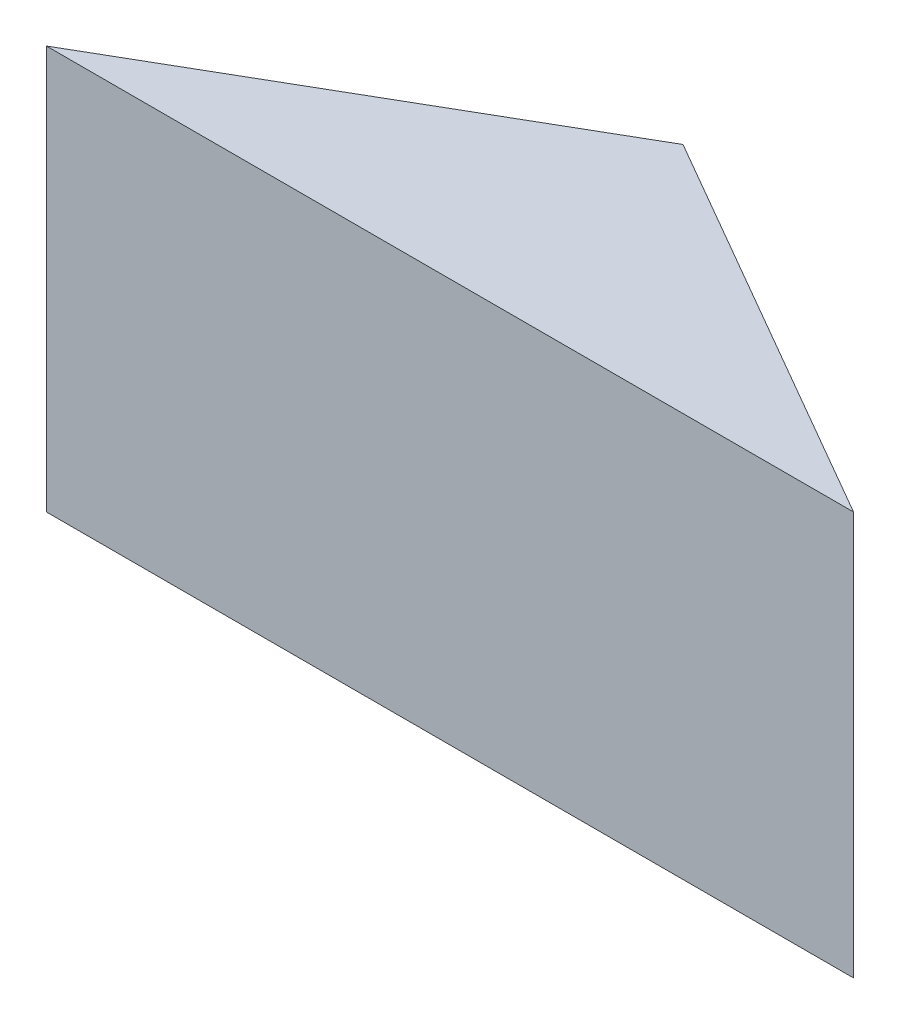
ISO-10303-21;
HEADER;
FILE_DESCRIPTION(('STEP AP214'),'2;1');
FILE_NAME('part.step','',(''),(''),'','','');
FILE_SCHEMA(('AUTOMOTIVE_DESIGN { 1 0 10303 214 1 1 1 1 }'));
ENDSEC;
DATA;
#1=APPLICATION_CONTEXT('core data for automotive mechanical design processes');
#2=APPLICATION_PROTOCOL_DEFINITION('international standard','automotive_design',2000,#1);
#3=PRODUCT_CONTEXT('',#1,'mechanical');
#4=PRODUCT('Part','Part','',(#3));
#5=PRODUCT_RELATED_PRODUCT_CATEGORY('part','',(#4));
#6=PRODUCT_DEFINITION_FORMATION('','',#4);
#7=PRODUCT_DEFINITION_CONTEXT('part definition',#1,'design');
#8=PRODUCT_DEFINITION('design','',#6,#7);
#9=PRODUCT_DEFINITION_SHAPE('','',#8);
#10=(LENGTH_UNIT() NAMED_UNIT(*) SI_UNIT(.MILLI.,.METRE.));
#11=(NAMED_UNIT(*) PLANE_ANGLE_UNIT() SI_UNIT($,.RADIAN.));
#12=(NAMED_UNIT(*) SI_UNIT($,.STERADIAN.) SOLID_ANGLE_UNIT());
#13=UNCERTAINTY_MEASURE_WITH_UNIT(LENGTH_MEASURE(1.E-05),#10,'distance_accuracy_value','');
#14=(GEOMETRIC_REPRESENTATION_CONTEXT(3) GLOBAL_UNCERTAINTY_ASSIGNED_CONTEXT((#13)) GLOBAL_UNIT_ASSIGNED_CONTEXT((#10,
#11,#12)) REPRESENTATION_CONTEXT('',''));
#15=CARTESIAN_POINT('',(0.,0.,0.));
#16=DIRECTION('',(0.,0.,1.));
#17=DIRECTION('',(1.,0.,0.));
#18=AXIS2_PLACEMENT_3D('',#15,#16,#17);
#19=CARTESIAN_POINT('',(0.,20.,0.));
#20=DIRECTION('',(0.,0.,-1.));
#21=DIRECTION('',(-1.,0.,0.));
#22=AXIS2_PLACEMENT_3D('',#19,#20,#21);
#23=PLANE('',#22);
#24=DIRECTION('',(1.,0.,0.));
#25=VECTOR('',#24,1.);
#26=CARTESIAN_POINT('',(0.,0.,0.));
#27=LINE('',#26,#25);
#28=CARTESIAN_POINT('',(-20.,0.,0.));
#29=VERTEX_POINT('',#28);
#30=CARTESIAN_POINT('',(20.,0.,0.));
#31=VERTEX_POINT('',#30);
#32=EDGE_CURVE('E90',#29,#31,#27,.T.);
#33=ORIENTED_EDGE('',*,*,#32,.T.);
#34=DIRECTION('',(0.,-1.,0.));
#35=VECTOR('',#34,1.);
#36=CARTESIAN_POINT('',(20.,20.,0.));
#37=LINE('',#36,#35);
#38=CARTESIAN_POINT('',(20.,20.,0.));
#39=VERTEX_POINT('',#38);
#40=EDGE_CURVE('E11',#39,#31,#37,.T.);
#41=ORIENTED_EDGE('',*,*,#40,.F.);
#42=DIRECTION('',(1.,0.,0.));
#43=VECTOR('',#42,1.);
#44=CARTESIAN_POINT('',(0.,20.,0.));
#45=LINE('',#44,#43);
#46=CARTESIAN_POINT('',(-20.,20.,0.));
#47=VERTEX_POINT('',#46);
#48=EDGE_CURVE('E84',#47,#39,#45,.T.);
#49=ORIENTED_EDGE('',*,*,#48,.F.);
#50=DIRECTION('',(0.,-1.,0.));
#51=VECTOR('',#50,1.);
#52=CARTESIAN_POINT('',(-20.,20.,0.));
#53=LINE('',#52,#51);
#54=EDGE_CURVE('E58',#47,#29,#53,.T.);
#55=ORIENTED_EDGE('',*,*,#54,.T.);
#56=EDGE_LOOP('',(#33,#41,#49,#55));
#57=FACE_BOUND('',#56,.T.);
#58=ADVANCED_FACE('F41',(#57),#23,.F.);
#59=CARTESIAN_POINT('',(4.9999999999999,20.,-8.66025403784433));
#60=DIRECTION('',(-0.499999999999995,0.,0.866025403784442));
#61=DIRECTION('',(0.866025403784442,0.,0.499999999999995));
#62=AXIS2_PLACEMENT_3D('',#59,#60,#61);
#63=PLANE('',#62);
#64=DIRECTION('',(-0.866025403784442,0.,-0.499999999999995));
#65=VECTOR('',#64,1.);
#66=CARTESIAN_POINT('',(4.9999999999999,0.,-8.66025403784433));
#67=LINE('',#66,#65);
#68=CARTESIAN_POINT('',(0.,0.,-11.5470053837924));
#69=VERTEX_POINT('',#68);
#70=EDGE_CURVE('E94',#31,#69,#67,.T.);
#71=ORIENTED_EDGE('',*,*,#70,.T.);
#72=DIRECTION('',(0.,-1.,0.));
#73=VECTOR('',#72,1.);
#74=CARTESIAN_POINT('',(0.,20.,-11.5470053837924));
#75=LINE('',#74,#73);
#76=CARTESIAN_POINT('',(0.,20.,-11.5470053837924));
#77=VERTEX_POINT('',#76);
#78=EDGE_CURVE('E50',#77,#69,#75,.T.);
#79=ORIENTED_EDGE('',*,*,#78,.F.);
#80=DIRECTION('',(-0.866025403784442,0.,-0.499999999999995));
#81=VECTOR('',#80,1.);
#82=CARTESIAN_POINT('',(4.9999999999999,20.,-8.66025403784433));
#83=LINE('',#82,#81);
#84=EDGE_CURVE('E76',#39,#77,#83,.T.);
#85=ORIENTED_EDGE('',*,*,#84,.F.);
#86=ORIENTED_EDGE('',*,*,#40,.T.);
#87=EDGE_LOOP('',(#71,#79,#85,#86));
#88=FACE_BOUND('',#87,.T.);
#89=ADVANCED_FACE('F78',(#88),#63,.F.);
#90=CARTESIAN_POINT('',(-4.9999999999999,20.,-8.66025403784433));
#91=DIRECTION('',(-0.499999999999995,0.,-0.866025403784441));
#92=DIRECTION('',(-0.866025403784441,0.,0.499999999999995));
#93=AXIS2_PLACEMENT_3D('',#90,#91,#92);
#94=PLANE('',#93);
#95=DIRECTION('',(0.866025403784441,0.,-0.499999999999995));
#96=VECTOR('',#95,1.);
#97=CARTESIAN_POINT('',(-4.9999999999999,0.,-8.66025403784433));
#98=LINE('',#97,#96);
#99=EDGE_CURVE('E88',#29,#69,#98,.T.);
#100=ORIENTED_EDGE('',*,*,#99,.F.);
#101=ORIENTED_EDGE('',*,*,#54,.F.);
#102=DIRECTION('',(0.866025403784441,0.,-0.499999999999995));
#103=VECTOR('',#102,1.);
#104=CARTESIAN_POINT('',(-4.9999999999999,20.,-8.66025403784433));
#105=LINE('',#104,#103);
#106=EDGE_CURVE('E83',#47,#77,#105,.T.);
#107=ORIENTED_EDGE('',*,*,#106,.T.);
#108=ORIENTED_EDGE('',*,*,#78,.T.);
#109=EDGE_LOOP('',(#100,#101,#107,#108));
#110=FACE_BOUND('',#109,.T.);
#111=ADVANCED_FACE('F105',(#110),#94,.T.);
#112=CARTESIAN_POINT('',(0.,20.,0.));
#113=DIRECTION('',(0.,1.,0.));
#114=DIRECTION('',(0.,0.,1.));
#115=AXIS2_PLACEMENT_3D('',#112,#113,#114);
#116=PLANE('',#115);
#117=ORIENTED_EDGE('',*,*,#48,.T.);
#118=ORIENTED_EDGE('',*,*,#84,.T.);
#119=ORIENTED_EDGE('',*,*,#106,.F.);
#120=EDGE_LOOP('',(#117,#118,#119));
#121=FACE_BOUND('',#120,.T.);
#122=ADVANCED_FACE('F86',(#121),#116,.T.);
#123=CARTESIAN_POINT('',(0.,0.,0.));
#124=DIRECTION('',(0.,1.,0.));
#125=DIRECTION('',(0.,0.,1.));
#126=AXIS2_PLACEMENT_3D('',#123,#124,#125);
#127=PLANE('',#126);
#128=ORIENTED_EDGE('',*,*,#32,.F.);
#129=ORIENTED_EDGE('',*,*,#99,.T.);
#130=ORIENTED_EDGE('',*,*,#70,.F.);
#131=EDGE_LOOP('',(#128,#129,#130));
#132=FACE_BOUND('',#131,.T.);
#133=ADVANCED_FACE('F112',(#132),#127,.F.);
#134=CLOSED_SHELL('',(#58,#89,#111,#122,#133));
#135=MANIFOLD_SOLID_BREP('B2',#134);
#136=ADVANCED_BREP_SHAPE_REPRESENTATION('',(#18,#135),#14);
#137=SHAPE_DEFINITION_REPRESENTATION(#9,#136);
ENDSEC;
END-ISO-10303-21;
